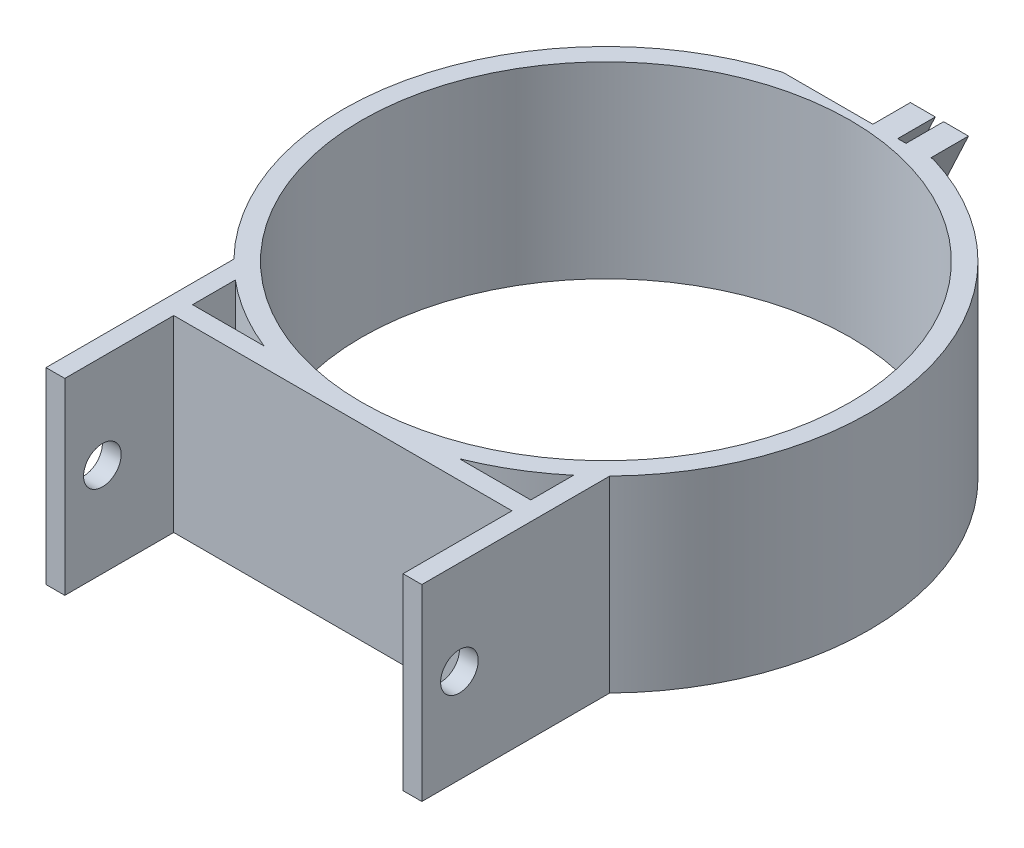
ISO-10303-21;
HEADER;
FILE_DESCRIPTION(('STEP AP214'),'2;1');
FILE_NAME('part.step','',(''),(''),'','','');
FILE_SCHEMA(('AUTOMOTIVE_DESIGN { 1 0 10303 214 1 1 1 1 }'));
ENDSEC;
DATA;
#1=APPLICATION_CONTEXT('core data for automotive mechanical design processes');
#2=APPLICATION_PROTOCOL_DEFINITION('international standard','automotive_design',2000,#1);
#3=PRODUCT_CONTEXT('',#1,'mechanical');
#4=PRODUCT('Part','Part','',(#3));
#5=PRODUCT_RELATED_PRODUCT_CATEGORY('part','',(#4));
#6=PRODUCT_DEFINITION_FORMATION('','',#4);
#7=PRODUCT_DEFINITION_CONTEXT('part definition',#1,'design');
#8=PRODUCT_DEFINITION('design','',#6,#7);
#9=PRODUCT_DEFINITION_SHAPE('','',#8);
#10=(LENGTH_UNIT() NAMED_UNIT(*) SI_UNIT(.MILLI.,.METRE.));
#11=(NAMED_UNIT(*) PLANE_ANGLE_UNIT() SI_UNIT($,.RADIAN.));
#12=(NAMED_UNIT(*) SI_UNIT($,.STERADIAN.) SOLID_ANGLE_UNIT());
#13=UNCERTAINTY_MEASURE_WITH_UNIT(LENGTH_MEASURE(1.E-05),#10,'distance_accuracy_value','');
#14=(GEOMETRIC_REPRESENTATION_CONTEXT(3) GLOBAL_UNCERTAINTY_ASSIGNED_CONTEXT((#13)) GLOBAL_UNIT_ASSIGNED_CONTEXT((#10,
#11,#12)) REPRESENTATION_CONTEXT('',''));
#15=CARTESIAN_POINT('',(0.,0.,0.));
#16=DIRECTION('',(0.,0.,1.));
#17=DIRECTION('',(1.,0.,0.));
#18=AXIS2_PLACEMENT_3D('',#15,#16,#17);
#19=CARTESIAN_POINT('',(-10.,25.,-38.5410196624969));
#20=DIRECTION('',(0.,0.,1.));
#21=DIRECTION('',(1.,0.,0.));
#22=AXIS2_PLACEMENT_3D('',#19,#20,#21);
#23=PLANE('',#22);
#24=DIRECTION('',(-1.,0.,0.));
#25=VECTOR('',#24,1.);
#26=CARTESIAN_POINT('',(-10.,0.,-38.5410196624969));
#27=LINE('',#26,#25);
#28=CARTESIAN_POINT('',(-6.38053468641869,0.,-38.5410196624969));
#29=VERTEX_POINT('',#28);
#30=CARTESIAN_POINT('',(-9.69066844330616,0.,-38.5410196624969));
#31=VERTEX_POINT('',#30);
#32=EDGE_CURVE('E355',#29,#31,#27,.T.);
#33=ORIENTED_EDGE('',*,*,#32,.T.);
#34=DIRECTION('',(-0.422618261740697,-0.906307787036651,0.));
#35=VECTOR('',#34,1.);
#36=CARTESIAN_POINT('',(-9.69066844330616,0.,-38.5410196624969));
#37=LINE('',#36,#35);
#38=CARTESIAN_POINT('',(1.96702301056874,25.,-38.5410196624969));
#39=VERTEX_POINT('',#38);
#40=EDGE_CURVE('E219',#39,#31,#37,.T.);
#41=ORIENTED_EDGE('',*,*,#40,.F.);
#42=DIRECTION('',(-1.,0.,0.));
#43=VECTOR('',#42,1.);
#44=CARTESIAN_POINT('',(-10.,25.,-38.5410196624969));
#45=LINE('',#44,#43);
#46=CARTESIAN_POINT('',(5.2771567674562,25.,-38.5410196624969));
#47=VERTEX_POINT('',#46);
#48=EDGE_CURVE('E334',#47,#39,#45,.T.);
#49=ORIENTED_EDGE('',*,*,#48,.F.);
#50=DIRECTION('',(0.422618261740697,0.906307787036651,0.));
#51=VECTOR('',#50,1.);
#52=CARTESIAN_POINT('',(5.2771567674562,25.,-38.5410196624969));
#53=LINE('',#52,#51);
#54=EDGE_CURVE('E241',#29,#47,#53,.T.);
#55=ORIENTED_EDGE('',*,*,#54,.F.);
#56=EDGE_LOOP('',(#33,#41,#49,#55));
#57=FACE_BOUND('',#56,.T.);
#58=ADVANCED_FACE('F33',(#57),#23,.F.);
#59=CARTESIAN_POINT('',(0.,25.,0.));
#60=DIRECTION('',(0.,1.,0.));
#61=DIRECTION('',(0.,0.,1.));
#62=AXIS2_PLACEMENT_3D('',#59,#60,#61);
#63=PLANE('',#62);
#64=DIRECTION('',(0.,0.,-1.));
#65=VECTOR('',#64,1.);
#66=CARTESIAN_POINT('',(9.69066844330617,25.,-33.5410196624969));
#67=LINE('',#66,#65);
#68=CARTESIAN_POINT('',(9.69066844330617,25.,-33.5410196624969));
#69=VERTEX_POINT('',#68);
#70=CARTESIAN_POINT('',(9.69066844330617,25.,-38.5410196624969));
#71=VERTEX_POINT('',#70);
#72=EDGE_CURVE('E195',#69,#71,#67,.T.);
#73=ORIENTED_EDGE('',*,*,#72,.T.);
#74=CARTESIAN_POINT('',(6.38053468641869,25.,-38.5410196624969));
#75=VERTEX_POINT('',#74);
#76=EDGE_CURVE('E57',#71,#75,#45,.T.);
#77=ORIENTED_EDGE('',*,*,#76,.T.);
#78=DIRECTION('',(0.,0.,-1.));
#79=VECTOR('',#78,1.);
#80=CARTESIAN_POINT('',(6.38053468641869,25.,-33.5410196624969));
#81=LINE('',#80,#79);
#82=CARTESIAN_POINT('',(6.38053468641869,25.,-33.5410196624969));
#83=VERTEX_POINT('',#82);
#84=EDGE_CURVE('E249',#83,#75,#81,.T.);
#85=ORIENTED_EDGE('',*,*,#84,.F.);
#86=DIRECTION('',(1.,0.,0.));
#87=VECTOR('',#86,1.);
#88=CARTESIAN_POINT('',(6.38053468641869,25.,-33.5410196624969));
#89=LINE('',#88,#87);
#90=CARTESIAN_POINT('',(5.2771567674562,25.,-33.5410196624969));
#91=VERTEX_POINT('',#90);
#92=EDGE_CURVE('E237',#91,#83,#89,.T.);
#93=ORIENTED_EDGE('',*,*,#92,.F.);
#94=DIRECTION('',(0.,0.,-1.));
#95=VECTOR('',#94,1.);
#96=CARTESIAN_POINT('',(5.2771567674562,25.,-33.5410196624969));
#97=LINE('',#96,#95);
#98=EDGE_CURVE('E253',#91,#47,#97,.T.);
#99=ORIENTED_EDGE('',*,*,#98,.T.);
#100=ORIENTED_EDGE('',*,*,#48,.T.);
#101=DIRECTION('',(0.,0.,-1.));
#102=VECTOR('',#101,1.);
#103=CARTESIAN_POINT('',(1.96702301056874,25.,-33.5410196624969));
#104=LINE('',#103,#102);
#105=CARTESIAN_POINT('',(1.96702301056874,25.,-33.5410196624969));
#106=VERTEX_POINT('',#105);
#107=EDGE_CURVE('E231',#106,#39,#104,.T.);
#108=ORIENTED_EDGE('',*,*,#107,.F.);
#109=DIRECTION('',(1.,0.,0.));
#110=VECTOR('',#109,1.);
#111=CARTESIAN_POINT('',(1.96702301056874,25.,-33.5410196624969));
#112=LINE('',#111,#110);
#113=CARTESIAN_POINT('',(-10.,25.,-33.5410196624969));
#114=VERTEX_POINT('',#113);
#115=EDGE_CURVE('E226',#114,#106,#112,.T.);
#116=ORIENTED_EDGE('',*,*,#115,.F.);
#117=CARTESIAN_POINT('',(0.,25.,0.));
#118=DIRECTION('',(0.,1.,0.));
#119=DIRECTION('',(0.,0.,1.));
#120=AXIS2_PLACEMENT_3D('',#117,#118,#119);
#121=CIRCLE('',#120,35.);
#122=CARTESIAN_POINT('',(-25.,25.,24.4948974278318));
#123=VERTEX_POINT('',#122);
#124=EDGE_CURVE('E336',#114,#123,#121,.T.);
#125=ORIENTED_EDGE('',*,*,#124,.T.);
#126=DIRECTION('',(0.,0.,1.));
#127=VECTOR('',#126,1.);
#128=CARTESIAN_POINT('',(-25.,25.,49.4948974278318));
#129=LINE('',#128,#127);
#130=CARTESIAN_POINT('',(-25.,25.,49.4948974278318));
#131=VERTEX_POINT('',#130);
#132=EDGE_CURVE('E317',#123,#131,#129,.T.);
#133=ORIENTED_EDGE('',*,*,#132,.T.);
#134=DIRECTION('',(1.,0.,0.));
#135=VECTOR('',#134,1.);
#136=CARTESIAN_POINT('',(-22.5,25.,49.4948974278318));
#137=LINE('',#136,#135);
#138=CARTESIAN_POINT('',(-22.5,25.,49.4948974278318));
#139=VERTEX_POINT('',#138);
#140=EDGE_CURVE('E320',#131,#139,#137,.T.);
#141=ORIENTED_EDGE('',*,*,#140,.T.);
#142=DIRECTION('',(0.,0.,-1.));
#143=VECTOR('',#142,1.);
#144=CARTESIAN_POINT('',(-22.5,25.,35.));
#145=LINE('',#144,#143);
#146=CARTESIAN_POINT('',(-22.5,25.,35.));
#147=VERTEX_POINT('',#146);
#148=EDGE_CURVE('E323',#139,#147,#145,.T.);
#149=ORIENTED_EDGE('',*,*,#148,.T.);
#150=DIRECTION('',(1.,0.,0.));
#151=VECTOR('',#150,1.);
#152=CARTESIAN_POINT('',(-22.5,25.,35.));
#153=LINE('',#152,#151);
#154=CARTESIAN_POINT('',(22.5,25.,35.));
#155=VERTEX_POINT('',#154);
#156=EDGE_CURVE('E325',#147,#155,#153,.T.);
#157=ORIENTED_EDGE('',*,*,#156,.T.);
#158=DIRECTION('',(0.,0.,1.));
#159=VECTOR('',#158,1.);
#160=CARTESIAN_POINT('',(22.5,25.,35.));
#161=LINE('',#160,#159);
#162=CARTESIAN_POINT('',(22.5,25.,49.4948974278318));
#163=VERTEX_POINT('',#162);
#164=EDGE_CURVE('E327',#155,#163,#161,.T.);
#165=ORIENTED_EDGE('',*,*,#164,.T.);
#166=DIRECTION('',(1.,0.,0.));
#167=VECTOR('',#166,1.);
#168=CARTESIAN_POINT('',(22.5,25.,49.4948974278318));
#169=LINE('',#168,#167);
#170=CARTESIAN_POINT('',(25.,25.,49.4948974278318));
#171=VERTEX_POINT('',#170);
#172=EDGE_CURVE('E329',#163,#171,#169,.T.);
#173=ORIENTED_EDGE('',*,*,#172,.T.);
#174=DIRECTION('',(0.,0.,-1.));
#175=VECTOR('',#174,1.);
#176=CARTESIAN_POINT('',(25.,25.,49.4948974278318));
#177=LINE('',#176,#175);
#178=CARTESIAN_POINT('',(25.,25.,24.4948974278318));
#179=VERTEX_POINT('',#178);
#180=EDGE_CURVE('E331',#171,#179,#177,.T.);
#181=ORIENTED_EDGE('',*,*,#180,.T.);
#182=CARTESIAN_POINT('',(0.,25.,0.));
#183=DIRECTION('',(0.,1.,0.));
#184=DIRECTION('',(0.,0.,1.));
#185=AXIS2_PLACEMENT_3D('',#182,#183,#184);
#186=CIRCLE('',#185,35.);
#187=CARTESIAN_POINT('',(9.99999999999999,25.,-33.5410196624969));
#188=VERTEX_POINT('',#187);
#189=EDGE_CURVE('E212',#179,#188,#186,.T.);
#190=ORIENTED_EDGE('',*,*,#189,.T.);
#191=DIRECTION('',(1.,0.,0.));
#192=VECTOR('',#191,1.);
#193=CARTESIAN_POINT('',(9.69066844330617,25.,-33.5410196624969));
#194=LINE('',#193,#192);
#195=EDGE_CURVE('E201',#69,#188,#194,.T.);
#196=ORIENTED_EDGE('',*,*,#195,.F.);
#197=EDGE_LOOP('',(#73,#77,#85,#93,#99,#100,#108,#116,#125,#133,#141,#149,#157,#165,#173,#181,
#190,#196));
#198=FACE_BOUND('',#197,.T.);
#199=CARTESIAN_POINT('',(0.,25.,0.));
#200=DIRECTION('',(0.,1.,0.));
#201=DIRECTION('',(0.,0.,1.));
#202=AXIS2_PLACEMENT_3D('',#199,#200,#201);
#203=CIRCLE('',#202,32.5);
#204=CARTESIAN_POINT('',(0.,25.,32.5));
#205=VERTEX_POINT('',#204);
#206=EDGE_CURVE('E311',#205,#205,#203,.T.);
#207=ORIENTED_EDGE('',*,*,#206,.F.);
#208=EDGE_LOOP('',(#207));
#209=FACE_BOUND('',#208,.T.);
#210=DIRECTION('',(0.,0.,1.));
#211=VECTOR('',#210,1.);
#212=CARTESIAN_POINT('',(-22.5,25.,26.809513236909));
#213=LINE('',#212,#211);
#214=CARTESIAN_POINT('',(-22.5,25.,26.809513236909));
#215=VERTEX_POINT('',#214);
#216=CARTESIAN_POINT('',(-22.5,25.,32.5));
#217=VERTEX_POINT('',#216);
#218=EDGE_CURVE('E289',#215,#217,#213,.T.);
#219=ORIENTED_EDGE('',*,*,#218,.F.);
#220=CARTESIAN_POINT('',(0.,25.,0.));
#221=DIRECTION('',(0.,-1.,0.));
#222=DIRECTION('',(0.,0.,1.));
#223=AXIS2_PLACEMENT_3D('',#220,#221,#222);
#224=CIRCLE('',#223,35.);
#225=CARTESIAN_POINT('',(-12.9903810567666,25.,32.5));
#226=VERTEX_POINT('',#225);
#227=EDGE_CURVE('E287',#226,#215,#224,.T.);
#228=ORIENTED_EDGE('',*,*,#227,.F.);
#229=DIRECTION('',(1.,0.,0.));
#230=VECTOR('',#229,1.);
#231=CARTESIAN_POINT('',(-22.5,25.,32.5));
#232=LINE('',#231,#230);
#233=EDGE_CURVE('E293',#217,#226,#232,.T.);
#234=ORIENTED_EDGE('',*,*,#233,.F.);
#235=EDGE_LOOP('',(#219,#228,#234));
#236=FACE_BOUND('',#235,.T.);
#237=DIRECTION('',(1.,0.,0.));
#238=VECTOR('',#237,1.);
#239=CARTESIAN_POINT('',(12.9903810567666,25.,32.5));
#240=LINE('',#239,#238);
#241=CARTESIAN_POINT('',(12.9903810567666,25.,32.5));
#242=VERTEX_POINT('',#241);
#243=CARTESIAN_POINT('',(22.5,25.,32.5));
#244=VERTEX_POINT('',#243);
#245=EDGE_CURVE('E265',#242,#244,#240,.T.);
#246=ORIENTED_EDGE('',*,*,#245,.F.);
#247=CARTESIAN_POINT('',(0.,25.,0.));
#248=DIRECTION('',(0.,-1.,0.));
#249=DIRECTION('',(0.,0.,1.));
#250=AXIS2_PLACEMENT_3D('',#247,#248,#249);
#251=CIRCLE('',#250,35.);
#252=CARTESIAN_POINT('',(22.5,25.,26.809513236909));
#253=VERTEX_POINT('',#252);
#254=EDGE_CURVE('E263',#253,#242,#251,.T.);
#255=ORIENTED_EDGE('',*,*,#254,.F.);
#256=DIRECTION('',(0.,0.,-1.));
#257=VECTOR('',#256,1.);
#258=CARTESIAN_POINT('',(22.5,25.,32.5));
#259=LINE('',#258,#257);
#260=EDGE_CURVE('E269',#244,#253,#259,.T.);
#261=ORIENTED_EDGE('',*,*,#260,.F.);
#262=EDGE_LOOP('',(#246,#255,#261));
#263=FACE_BOUND('',#262,.T.);
#264=ADVANCED_FACE('F209',(#198,#209,#236,#263),#63,.T.);
#265=CARTESIAN_POINT('',(0.,0.,0.));
#266=DIRECTION('',(0.,1.,0.));
#267=DIRECTION('',(0.,0.,1.));
#268=AXIS2_PLACEMENT_3D('',#265,#266,#267);
#269=PLANE('',#268);
#270=CARTESIAN_POINT('',(-1.96702301056873,0.,-38.5410196624969));
#271=VERTEX_POINT('',#270);
#272=CARTESIAN_POINT('',(-5.2771567674562,0.,-38.5410196624969));
#273=VERTEX_POINT('',#272);
#274=EDGE_CURVE('E356',#271,#273,#27,.T.);
#275=ORIENTED_EDGE('',*,*,#274,.F.);
#276=DIRECTION('',(0.,0.,-1.));
#277=VECTOR('',#276,1.);
#278=CARTESIAN_POINT('',(-1.96702301056873,0.,-33.5410196624969));
#279=LINE('',#278,#277);
#280=CARTESIAN_POINT('',(-1.96702301056873,0.,-33.5410196624969));
#281=VERTEX_POINT('',#280);
#282=EDGE_CURVE('E49',#281,#271,#279,.T.);
#283=ORIENTED_EDGE('',*,*,#282,.F.);
#284=DIRECTION('',(1.,0.,0.));
#285=VECTOR('',#284,1.);
#286=CARTESIAN_POINT('',(0.,0.,-33.5410196624969));
#287=LINE('',#286,#285);
#288=CARTESIAN_POINT('',(9.99999999999999,0.,-33.5410196624969));
#289=VERTEX_POINT('',#288);
#290=EDGE_CURVE('E207',#281,#289,#287,.T.);
#291=ORIENTED_EDGE('',*,*,#290,.T.);
#292=CARTESIAN_POINT('',(0.,0.,0.));
#293=DIRECTION('',(0.,1.,0.));
#294=DIRECTION('',(0.,0.,1.));
#295=AXIS2_PLACEMENT_3D('',#292,#293,#294);
#296=CIRCLE('',#295,35.);
#297=CARTESIAN_POINT('',(25.,0.,24.4948974278318));
#298=VERTEX_POINT('',#297);
#299=EDGE_CURVE('E352',#298,#289,#296,.T.);
#300=ORIENTED_EDGE('',*,*,#299,.F.);
#301=DIRECTION('',(0.,0.,-1.));
#302=VECTOR('',#301,1.);
#303=CARTESIAN_POINT('',(25.,0.,35.));
#304=LINE('',#303,#302);
#305=CARTESIAN_POINT('',(25.,0.,49.4948974278318));
#306=VERTEX_POINT('',#305);
#307=EDGE_CURVE('E350',#306,#298,#304,.T.);
#308=ORIENTED_EDGE('',*,*,#307,.F.);
#309=DIRECTION('',(1.,0.,0.));
#310=VECTOR('',#309,1.);
#311=CARTESIAN_POINT('',(22.5,0.,49.4948974278318));
#312=LINE('',#311,#310);
#313=CARTESIAN_POINT('',(22.5,0.,49.4948974278318));
#314=VERTEX_POINT('',#313);
#315=EDGE_CURVE('E347',#314,#306,#312,.T.);
#316=ORIENTED_EDGE('',*,*,#315,.F.);
#317=DIRECTION('',(0.,0.,1.));
#318=VECTOR('',#317,1.);
#319=CARTESIAN_POINT('',(22.5,0.,35.));
#320=LINE('',#319,#318);
#321=CARTESIAN_POINT('',(22.5,0.,35.));
#322=VERTEX_POINT('',#321);
#323=EDGE_CURVE('E345',#322,#314,#320,.T.);
#324=ORIENTED_EDGE('',*,*,#323,.F.);
#325=DIRECTION('',(1.,0.,0.));
#326=VECTOR('',#325,1.);
#327=CARTESIAN_POINT('',(-22.5,0.,35.));
#328=LINE('',#327,#326);
#329=CARTESIAN_POINT('',(-22.5,0.,35.));
#330=VERTEX_POINT('',#329);
#331=EDGE_CURVE('E343',#330,#322,#328,.T.);
#332=ORIENTED_EDGE('',*,*,#331,.F.);
#333=DIRECTION('',(0.,0.,-1.));
#334=VECTOR('',#333,1.);
#335=CARTESIAN_POINT('',(-22.5,0.,35.));
#336=LINE('',#335,#334);
#337=CARTESIAN_POINT('',(-22.5,0.,49.4948974278318));
#338=VERTEX_POINT('',#337);
#339=EDGE_CURVE('E341',#338,#330,#336,.T.);
#340=ORIENTED_EDGE('',*,*,#339,.F.);
#341=DIRECTION('',(1.,0.,0.));
#342=VECTOR('',#341,1.);
#343=CARTESIAN_POINT('',(-22.5,0.,49.4948974278318));
#344=LINE('',#343,#342);
#345=CARTESIAN_POINT('',(-25.,0.,49.4948974278318));
#346=VERTEX_POINT('',#345);
#347=EDGE_CURVE('E314',#346,#338,#344,.T.);
#348=ORIENTED_EDGE('',*,*,#347,.F.);
#349=DIRECTION('',(0.,0.,1.));
#350=VECTOR('',#349,1.);
#351=CARTESIAN_POINT('',(-25.,0.,35.));
#352=LINE('',#351,#350);
#353=CARTESIAN_POINT('',(-25.,0.,24.4948974278318));
#354=VERTEX_POINT('',#353);
#355=EDGE_CURVE('E321',#354,#346,#352,.T.);
#356=ORIENTED_EDGE('',*,*,#355,.F.);
#357=CARTESIAN_POINT('',(0.,0.,0.));
#358=DIRECTION('',(0.,1.,0.));
#359=DIRECTION('',(0.,0.,1.));
#360=AXIS2_PLACEMENT_3D('',#357,#358,#359);
#361=CIRCLE('',#360,35.);
#362=CARTESIAN_POINT('',(-9.99999999999998,0.,-33.5410196624969));
#363=VERTEX_POINT('',#362);
#364=EDGE_CURVE('E358',#363,#354,#361,.T.);
#365=ORIENTED_EDGE('',*,*,#364,.F.);
#366=DIRECTION('',(-1.,0.,0.));
#367=VECTOR('',#366,1.);
#368=CARTESIAN_POINT('',(-9.99999999999999,0.,-33.5410196624969));
#369=LINE('',#368,#367);
#370=CARTESIAN_POINT('',(-9.69066844330616,0.,-33.5410196624969));
#371=VERTEX_POINT('',#370);
#372=EDGE_CURVE('E224',#371,#363,#369,.T.);
#373=ORIENTED_EDGE('',*,*,#372,.F.);
#374=DIRECTION('',(0.,0.,-1.));
#375=VECTOR('',#374,1.);
#376=CARTESIAN_POINT('',(-9.69066844330616,0.,-33.5410196624969));
#377=LINE('',#376,#375);
#378=EDGE_CURVE('E229',#371,#31,#377,.T.);
#379=ORIENTED_EDGE('',*,*,#378,.T.);
#380=ORIENTED_EDGE('',*,*,#32,.F.);
#381=DIRECTION('',(0.,0.,-1.));
#382=VECTOR('',#381,1.);
#383=CARTESIAN_POINT('',(-6.38053468641869,0.,-33.5410196624969));
#384=LINE('',#383,#382);
#385=CARTESIAN_POINT('',(-6.38053468641869,0.,-33.5410196624969));
#386=VERTEX_POINT('',#385);
#387=EDGE_CURVE('E257',#386,#29,#384,.T.);
#388=ORIENTED_EDGE('',*,*,#387,.F.);
#389=DIRECTION('',(-1.,0.,0.));
#390=VECTOR('',#389,1.);
#391=CARTESIAN_POINT('',(-6.38053468641869,0.,-33.5410196624969));
#392=LINE('',#391,#390);
#393=CARTESIAN_POINT('',(-5.2771567674562,0.,-33.5410196624969));
#394=VERTEX_POINT('',#393);
#395=EDGE_CURVE('E244',#394,#386,#392,.T.);
#396=ORIENTED_EDGE('',*,*,#395,.F.);
#397=DIRECTION('',(0.,0.,-1.));
#398=VECTOR('',#397,1.);
#399=CARTESIAN_POINT('',(-5.2771567674562,0.,-33.5410196624969));
#400=LINE('',#399,#398);
#401=EDGE_CURVE('E259',#394,#273,#400,.T.);
#402=ORIENTED_EDGE('',*,*,#401,.T.);
#403=EDGE_LOOP('',(#275,#283,#291,#300,#308,#316,#324,#332,#340,#348,#356,#365,#373,#379,#380,
#388,#396,#402));
#404=FACE_BOUND('',#403,.T.);
#405=CARTESIAN_POINT('',(0.,0.,0.));
#406=DIRECTION('',(0.,-1.,0.));
#407=DIRECTION('',(0.,0.,1.));
#408=AXIS2_PLACEMENT_3D('',#405,#406,#407);
#409=CIRCLE('',#408,35.);
#410=CARTESIAN_POINT('',(-12.9903810567666,0.,32.5));
#411=VERTEX_POINT('',#410);
#412=CARTESIAN_POINT('',(-22.5,0.,26.809513236909));
#413=VERTEX_POINT('',#412);
#414=EDGE_CURVE('E286',#411,#413,#409,.T.);
#415=ORIENTED_EDGE('',*,*,#414,.T.);
#416=DIRECTION('',(0.,0.,1.));
#417=VECTOR('',#416,1.);
#418=CARTESIAN_POINT('',(-22.5,0.,26.809513236909));
#419=LINE('',#418,#417);
#420=CARTESIAN_POINT('',(-22.5,0.,32.5));
#421=VERTEX_POINT('',#420);
#422=EDGE_CURVE('E298',#413,#421,#419,.T.);
#423=ORIENTED_EDGE('',*,*,#422,.T.);
#424=DIRECTION('',(1.,0.,0.));
#425=VECTOR('',#424,1.);
#426=CARTESIAN_POINT('',(-22.5,0.,32.5));
#427=LINE('',#426,#425);
#428=EDGE_CURVE('E290',#421,#411,#427,.T.);
#429=ORIENTED_EDGE('',*,*,#428,.T.);
#430=EDGE_LOOP('',(#415,#423,#429));
#431=FACE_BOUND('',#430,.T.);
#432=CARTESIAN_POINT('',(0.,0.,0.));
#433=DIRECTION('',(0.,1.,0.));
#434=DIRECTION('',(0.,0.,1.));
#435=AXIS2_PLACEMENT_3D('',#432,#433,#434);
#436=CIRCLE('',#435,32.5);
#437=CARTESIAN_POINT('',(0.,0.,32.5));
#438=VERTEX_POINT('',#437);
#439=EDGE_CURVE('E310',#438,#438,#436,.T.);
#440=ORIENTED_EDGE('',*,*,#439,.T.);
#441=EDGE_LOOP('',(#440));
#442=FACE_BOUND('',#441,.T.);
#443=CARTESIAN_POINT('',(0.,0.,0.));
#444=DIRECTION('',(0.,-1.,0.));
#445=DIRECTION('',(0.,0.,1.));
#446=AXIS2_PLACEMENT_3D('',#443,#444,#445);
#447=CIRCLE('',#446,35.);
#448=CARTESIAN_POINT('',(22.5,0.,26.809513236909));
#449=VERTEX_POINT('',#448);
#450=CARTESIAN_POINT('',(12.9903810567666,0.,32.5));
#451=VERTEX_POINT('',#450);
#452=EDGE_CURVE('E256',#449,#451,#447,.T.);
#453=ORIENTED_EDGE('',*,*,#452,.T.);
#454=DIRECTION('',(1.,0.,0.));
#455=VECTOR('',#454,1.);
#456=CARTESIAN_POINT('',(12.9903810567666,0.,32.5));
#457=LINE('',#456,#455);
#458=CARTESIAN_POINT('',(22.5,0.,32.5));
#459=VERTEX_POINT('',#458);
#460=EDGE_CURVE('E274',#451,#459,#457,.T.);
#461=ORIENTED_EDGE('',*,*,#460,.T.);
#462=DIRECTION('',(0.,0.,-1.));
#463=VECTOR('',#462,1.);
#464=CARTESIAN_POINT('',(22.5,0.,32.5));
#465=LINE('',#464,#463);
#466=EDGE_CURVE('E266',#459,#449,#465,.T.);
#467=ORIENTED_EDGE('',*,*,#466,.T.);
#468=EDGE_LOOP('',(#453,#461,#467));
#469=FACE_BOUND('',#468,.T.);
#470=ADVANCED_FACE('F395',(#404,#431,#442,#469),#269,.F.);
#471=CARTESIAN_POINT('',(-22.5,25.,49.4948974278318));
#472=DIRECTION('',(0.,0.,-1.));
#473=DIRECTION('',(-1.,0.,0.));
#474=AXIS2_PLACEMENT_3D('',#471,#472,#473);
#475=PLANE('',#474);
#476=ORIENTED_EDGE('',*,*,#347,.T.);
#477=DIRECTION('',(0.,-1.,0.));
#478=VECTOR('',#477,1.);
#479=CARTESIAN_POINT('',(-22.5,25.,49.4948974278318));
#480=LINE('',#479,#478);
#481=EDGE_CURVE('E42',#139,#338,#480,.T.);
#482=ORIENTED_EDGE('',*,*,#481,.F.);
#483=ORIENTED_EDGE('',*,*,#140,.F.);
#484=DIRECTION('',(0.,-1.,0.));
#485=VECTOR('',#484,1.);
#486=CARTESIAN_POINT('',(-25.,25.,49.4948974278318));
#487=LINE('',#486,#485);
#488=EDGE_CURVE('E11',#131,#346,#487,.T.);
#489=ORIENTED_EDGE('',*,*,#488,.T.);
#490=EDGE_LOOP('',(#476,#482,#483,#489));
#491=FACE_BOUND('',#490,.T.);
#492=ADVANCED_FACE('F35',(#491),#475,.F.);
#493=CARTESIAN_POINT('',(-22.5,25.,35.));
#494=DIRECTION('',(-1.,0.,0.));
#495=DIRECTION('',(0.,0.,1.));
#496=AXIS2_PLACEMENT_3D('',#493,#494,#495);
#497=PLANE('',#496);
#498=CARTESIAN_POINT('',(-22.5,12.5,44.4948974278318));
#499=DIRECTION('',(-1.,0.,0.));
#500=DIRECTION('',(0.,0.,1.));
#501=AXIS2_PLACEMENT_3D('',#498,#499,#500);
#502=CIRCLE('',#501,2.5);
#503=CARTESIAN_POINT('',(-22.5,12.5,46.9948974278318));
#504=VERTEX_POINT('',#503);
#505=EDGE_CURVE('E218',#504,#504,#502,.T.);
#506=ORIENTED_EDGE('',*,*,#505,.T.);
#507=EDGE_LOOP('',(#506));
#508=FACE_BOUND('',#507,.T.);
#509=ORIENTED_EDGE('',*,*,#339,.T.);
#510=DIRECTION('',(0.,-1.,0.));
#511=VECTOR('',#510,1.);
#512=CARTESIAN_POINT('',(-22.5,25.,35.));
#513=LINE('',#512,#511);
#514=EDGE_CURVE('E380',#147,#330,#513,.T.);
#515=ORIENTED_EDGE('',*,*,#514,.F.);
#516=ORIENTED_EDGE('',*,*,#148,.F.);
#517=ORIENTED_EDGE('',*,*,#481,.T.);
#518=EDGE_LOOP('',(#509,#515,#516,#517));
#519=FACE_BOUND('',#518,.T.);
#520=ADVANCED_FACE('F388',(#508,#519),#497,.F.);
#521=CARTESIAN_POINT('',(-22.5,25.,35.));
#522=DIRECTION('',(0.,0.,-1.));
#523=DIRECTION('',(-1.,0.,0.));
#524=AXIS2_PLACEMENT_3D('',#521,#522,#523);
#525=PLANE('',#524);
#526=ORIENTED_EDGE('',*,*,#331,.T.);
#527=DIRECTION('',(0.,-1.,0.));
#528=VECTOR('',#527,1.);
#529=CARTESIAN_POINT('',(22.5,25.,35.));
#530=LINE('',#529,#528);
#531=EDGE_CURVE('E377',#155,#322,#530,.T.);
#532=ORIENTED_EDGE('',*,*,#531,.F.);
#533=ORIENTED_EDGE('',*,*,#156,.F.);
#534=ORIENTED_EDGE('',*,*,#514,.T.);
#535=EDGE_LOOP('',(#526,#532,#533,#534));
#536=FACE_BOUND('',#535,.T.);
#537=ADVANCED_FACE('F402',(#536),#525,.F.);
#538=CARTESIAN_POINT('',(22.5,25.,35.));
#539=DIRECTION('',(1.,0.,0.));
#540=DIRECTION('',(0.,0.,-1.));
#541=AXIS2_PLACEMENT_3D('',#538,#539,#540);
#542=PLANE('',#541);
#543=CARTESIAN_POINT('',(22.5,12.5,44.4948974278318));
#544=DIRECTION('',(1.,0.,0.));
#545=DIRECTION('',(0.,0.,-1.));
#546=AXIS2_PLACEMENT_3D('',#543,#544,#545);
#547=CIRCLE('',#546,2.5);
#548=CARTESIAN_POINT('',(22.5,12.5,41.9948974278318));
#549=VERTEX_POINT('',#548);
#550=EDGE_CURVE('E582',#549,#549,#547,.T.);
#551=ORIENTED_EDGE('',*,*,#550,.T.);
#552=EDGE_LOOP('',(#551));
#553=FACE_BOUND('',#552,.T.);
#554=ORIENTED_EDGE('',*,*,#323,.T.);
#555=DIRECTION('',(0.,-1.,0.));
#556=VECTOR('',#555,1.);
#557=CARTESIAN_POINT('',(22.5,25.,49.4948974278318));
#558=LINE('',#557,#556);
#559=EDGE_CURVE('E374',#163,#314,#558,.T.);
#560=ORIENTED_EDGE('',*,*,#559,.F.);
#561=ORIENTED_EDGE('',*,*,#164,.F.);
#562=ORIENTED_EDGE('',*,*,#531,.T.);
#563=EDGE_LOOP('',(#554,#560,#561,#562));
#564=FACE_BOUND('',#563,.T.);
#565=ADVANCED_FACE('F406',(#553,#564),#542,.F.);
#566=CARTESIAN_POINT('',(22.5,25.,49.4948974278318));
#567=DIRECTION('',(0.,0.,-1.));
#568=DIRECTION('',(-1.,0.,0.));
#569=AXIS2_PLACEMENT_3D('',#566,#567,#568);
#570=PLANE('',#569);
#571=ORIENTED_EDGE('',*,*,#315,.T.);
#572=DIRECTION('',(0.,-1.,0.));
#573=VECTOR('',#572,1.);
#574=CARTESIAN_POINT('',(25.,25.,49.4948974278318));
#575=LINE('',#574,#573);
#576=EDGE_CURVE('E371',#171,#306,#575,.T.);
#577=ORIENTED_EDGE('',*,*,#576,.F.);
#578=ORIENTED_EDGE('',*,*,#172,.F.);
#579=ORIENTED_EDGE('',*,*,#559,.T.);
#580=EDGE_LOOP('',(#571,#577,#578,#579));
#581=FACE_BOUND('',#580,.T.);
#582=ADVANCED_FACE('F453',(#581),#570,.F.);
#583=CARTESIAN_POINT('',(25.,25.,35.));
#584=DIRECTION('',(-1.,0.,0.));
#585=DIRECTION('',(0.,0.,1.));
#586=AXIS2_PLACEMENT_3D('',#583,#584,#585);
#587=PLANE('',#586);
#588=CARTESIAN_POINT('',(25.,12.5,44.4948974278318));
#589=DIRECTION('',(-1.,0.,0.));
#590=DIRECTION('',(0.,0.,1.));
#591=AXIS2_PLACEMENT_3D('',#588,#589,#590);
#592=CIRCLE('',#591,2.5);
#593=CARTESIAN_POINT('',(25.,12.5,46.9948974278318));
#594=VERTEX_POINT('',#593);
#595=EDGE_CURVE('E584',#594,#594,#592,.T.);
#596=ORIENTED_EDGE('',*,*,#595,.T.);
#597=EDGE_LOOP('',(#596));
#598=FACE_BOUND('',#597,.T.);
#599=ORIENTED_EDGE('',*,*,#307,.T.);
#600=DIRECTION('',(0.,-1.,0.));
#601=VECTOR('',#600,1.);
#602=CARTESIAN_POINT('',(25.,25.,24.4948974278318));
#603=LINE('',#602,#601);
#604=EDGE_CURVE('E368',#179,#298,#603,.T.);
#605=ORIENTED_EDGE('',*,*,#604,.F.);
#606=ORIENTED_EDGE('',*,*,#180,.F.);
#607=ORIENTED_EDGE('',*,*,#576,.T.);
#608=EDGE_LOOP('',(#599,#605,#606,#607));
#609=FACE_BOUND('',#608,.T.);
#610=ADVANCED_FACE('F451',(#598,#609),#587,.F.);
#611=CARTESIAN_POINT('',(0.,25.,0.));
#612=DIRECTION('',(0.,-1.,0.));
#613=DIRECTION('',(0.,0.,-1.));
#614=AXIS2_PLACEMENT_3D('',#611,#612,#613);
#615=CYLINDRICAL_SURFACE('',#614,35.);
#616=ORIENTED_EDGE('',*,*,#299,.T.);
#617=DIRECTION('',(0.,-1.,0.));
#618=VECTOR('',#617,1.);
#619=CARTESIAN_POINT('',(10.,25.,-33.5410196624969));
#620=LINE('',#619,#618);
#621=EDGE_CURVE('E366',#188,#289,#620,.T.);
#622=ORIENTED_EDGE('',*,*,#621,.F.);
#623=ORIENTED_EDGE('',*,*,#189,.F.);
#624=ORIENTED_EDGE('',*,*,#604,.T.);
#625=EDGE_LOOP('',(#616,#622,#623,#624));
#626=FACE_BOUND('',#625,.T.);
#627=ADVANCED_FACE('F447',(#626),#615,.T.);
#628=ORIENTED_EDGE('',*,*,#76,.F.);
#629=DIRECTION('',(0.422618261740697,0.906307787036651,0.));
#630=VECTOR('',#629,1.);
#631=CARTESIAN_POINT('',(-1.96702301056873,0.,-38.5410196624969));
#632=LINE('',#631,#630);
#633=EDGE_CURVE('E199',#271,#71,#632,.T.);
#634=ORIENTED_EDGE('',*,*,#633,.F.);
#635=ORIENTED_EDGE('',*,*,#274,.T.);
#636=DIRECTION('',(-0.422618261740697,-0.906307787036651,0.));
#637=VECTOR('',#636,1.);
#638=CARTESIAN_POINT('',(6.38053468641869,25.,-38.5410196624969));
#639=LINE('',#638,#637);
#640=EDGE_CURVE('E236',#75,#273,#639,.T.);
#641=ORIENTED_EDGE('',*,*,#640,.F.);
#642=EDGE_LOOP('',(#628,#634,#635,#641));
#643=FACE_BOUND('',#642,.T.);
#644=ADVANCED_FACE('F444',(#643),#23,.F.);
#645=CARTESIAN_POINT('',(0.,25.,0.));
#646=DIRECTION('',(0.,-1.,0.));
#647=DIRECTION('',(0.,0.,-1.));
#648=AXIS2_PLACEMENT_3D('',#645,#646,#647);
#649=CYLINDRICAL_SURFACE('',#648,35.);
#650=ORIENTED_EDGE('',*,*,#364,.T.);
#651=DIRECTION('',(0.,-1.,0.));
#652=VECTOR('',#651,1.);
#653=CARTESIAN_POINT('',(-25.,25.,24.4948974278318));
#654=LINE('',#653,#652);
#655=EDGE_CURVE('E339',#123,#354,#654,.T.);
#656=ORIENTED_EDGE('',*,*,#655,.F.);
#657=ORIENTED_EDGE('',*,*,#124,.F.);
#658=DIRECTION('',(0.,-1.,0.));
#659=VECTOR('',#658,1.);
#660=CARTESIAN_POINT('',(-9.99999999999998,25.,-33.5410196624969));
#661=LINE('',#660,#659);
#662=EDGE_CURVE('E363',#114,#363,#661,.T.);
#663=ORIENTED_EDGE('',*,*,#662,.T.);
#664=EDGE_LOOP('',(#650,#656,#657,#663));
#665=FACE_BOUND('',#664,.T.);
#666=ADVANCED_FACE('F417',(#665),#649,.T.);
#667=CARTESIAN_POINT('',(-25.,25.,35.));
#668=DIRECTION('',(1.,0.,0.));
#669=DIRECTION('',(0.,0.,-1.));
#670=AXIS2_PLACEMENT_3D('',#667,#668,#669);
#671=PLANE('',#670);
#672=CARTESIAN_POINT('',(-25.,12.5,44.4948974278318));
#673=DIRECTION('',(1.,0.,0.));
#674=DIRECTION('',(0.,0.,-1.));
#675=AXIS2_PLACEMENT_3D('',#672,#673,#674);
#676=CIRCLE('',#675,2.5);
#677=CARTESIAN_POINT('',(-25.,12.5,41.9948974278318));
#678=VERTEX_POINT('',#677);
#679=EDGE_CURVE('E37',#678,#678,#676,.T.);
#680=ORIENTED_EDGE('',*,*,#679,.T.);
#681=EDGE_LOOP('',(#680));
#682=FACE_BOUND('',#681,.T.);
#683=ORIENTED_EDGE('',*,*,#355,.T.);
#684=ORIENTED_EDGE('',*,*,#488,.F.);
#685=ORIENTED_EDGE('',*,*,#132,.F.);
#686=ORIENTED_EDGE('',*,*,#655,.T.);
#687=EDGE_LOOP('',(#683,#684,#685,#686));
#688=FACE_BOUND('',#687,.T.);
#689=ADVANCED_FACE('F412',(#682,#688),#671,.F.);
#690=CARTESIAN_POINT('',(0.,25.,0.));
#691=DIRECTION('',(0.,-1.,0.));
#692=DIRECTION('',(0.,0.,-1.));
#693=AXIS2_PLACEMENT_3D('',#690,#691,#692);
#694=CYLINDRICAL_SURFACE('',#693,32.5);
#695=ORIENTED_EDGE('',*,*,#206,.T.);
#696=EDGE_LOOP('',(#695));
#697=FACE_BOUND('',#696,.T.);
#698=ORIENTED_EDGE('',*,*,#439,.F.);
#699=EDGE_LOOP('',(#698));
#700=FACE_BOUND('',#699,.T.);
#701=ADVANCED_FACE('F498',(#697,#700),#694,.F.);
#702=CARTESIAN_POINT('',(0.,25.,0.));
#703=DIRECTION('',(0.,-1.,0.));
#704=DIRECTION('',(0.,0.,-1.));
#705=AXIS2_PLACEMENT_3D('',#702,#703,#704);
#706=CYLINDRICAL_SURFACE('',#705,35.);
#707=ORIENTED_EDGE('',*,*,#414,.F.);
#708=DIRECTION('',(0.,-1.,0.));
#709=VECTOR('',#708,1.);
#710=CARTESIAN_POINT('',(-12.9903810567666,25.,32.5));
#711=LINE('',#710,#709);
#712=EDGE_CURVE('E295',#226,#411,#711,.T.);
#713=ORIENTED_EDGE('',*,*,#712,.F.);
#714=ORIENTED_EDGE('',*,*,#227,.T.);
#715=DIRECTION('',(0.,-1.,0.));
#716=VECTOR('',#715,1.);
#717=CARTESIAN_POINT('',(-22.5,25.,26.809513236909));
#718=LINE('',#717,#716);
#719=EDGE_CURVE('E307',#215,#413,#718,.T.);
#720=ORIENTED_EDGE('',*,*,#719,.T.);
#721=EDGE_LOOP('',(#707,#713,#714,#720));
#722=FACE_BOUND('',#721,.T.);
#723=ADVANCED_FACE('F562',(#722),#706,.T.);
#724=CARTESIAN_POINT('',(-22.5,25.,26.809513236909));
#725=DIRECTION('',(1.,0.,0.));
#726=DIRECTION('',(0.,0.,-1.));
#727=AXIS2_PLACEMENT_3D('',#724,#725,#726);
#728=PLANE('',#727);
#729=ORIENTED_EDGE('',*,*,#422,.F.);
#730=ORIENTED_EDGE('',*,*,#719,.F.);
#731=ORIENTED_EDGE('',*,*,#218,.T.);
#732=DIRECTION('',(0.,-1.,0.));
#733=VECTOR('',#732,1.);
#734=CARTESIAN_POINT('',(-22.5,25.,32.5));
#735=LINE('',#734,#733);
#736=EDGE_CURVE('E305',#217,#421,#735,.T.);
#737=ORIENTED_EDGE('',*,*,#736,.T.);
#738=EDGE_LOOP('',(#729,#730,#731,#737));
#739=FACE_BOUND('',#738,.T.);
#740=ADVANCED_FACE('F558',(#739),#728,.T.);
#741=CARTESIAN_POINT('',(-22.5,25.,32.5));
#742=DIRECTION('',(0.,0.,-1.));
#743=DIRECTION('',(-1.,0.,0.));
#744=AXIS2_PLACEMENT_3D('',#741,#742,#743);
#745=PLANE('',#744);
#746=ORIENTED_EDGE('',*,*,#428,.F.);
#747=ORIENTED_EDGE('',*,*,#736,.F.);
#748=ORIENTED_EDGE('',*,*,#233,.T.);
#749=ORIENTED_EDGE('',*,*,#712,.T.);
#750=EDGE_LOOP('',(#746,#747,#748,#749));
#751=FACE_BOUND('',#750,.T.);
#752=ADVANCED_FACE('F554',(#751),#745,.T.);
#753=CARTESIAN_POINT('',(0.,25.,0.));
#754=DIRECTION('',(0.,-1.,0.));
#755=DIRECTION('',(0.,0.,-1.));
#756=AXIS2_PLACEMENT_3D('',#753,#754,#755);
#757=CYLINDRICAL_SURFACE('',#756,35.);
#758=ORIENTED_EDGE('',*,*,#452,.F.);
#759=DIRECTION('',(0.,-1.,0.));
#760=VECTOR('',#759,1.);
#761=CARTESIAN_POINT('',(22.5,25.,26.809513236909));
#762=LINE('',#761,#760);
#763=EDGE_CURVE('E271',#253,#449,#762,.T.);
#764=ORIENTED_EDGE('',*,*,#763,.F.);
#765=ORIENTED_EDGE('',*,*,#254,.T.);
#766=DIRECTION('',(0.,-1.,0.));
#767=VECTOR('',#766,1.);
#768=CARTESIAN_POINT('',(12.9903810567666,25.,32.5));
#769=LINE('',#768,#767);
#770=EDGE_CURVE('E283',#242,#451,#769,.T.);
#771=ORIENTED_EDGE('',*,*,#770,.T.);
#772=EDGE_LOOP('',(#758,#764,#765,#771));
#773=FACE_BOUND('',#772,.T.);
#774=ADVANCED_FACE('F550',(#773),#757,.T.);
#775=CARTESIAN_POINT('',(12.9903810567666,25.,32.5));
#776=DIRECTION('',(0.,0.,-1.));
#777=DIRECTION('',(-1.,0.,0.));
#778=AXIS2_PLACEMENT_3D('',#775,#776,#777);
#779=PLANE('',#778);
#780=ORIENTED_EDGE('',*,*,#460,.F.);
#781=ORIENTED_EDGE('',*,*,#770,.F.);
#782=ORIENTED_EDGE('',*,*,#245,.T.);
#783=DIRECTION('',(0.,-1.,0.));
#784=VECTOR('',#783,1.);
#785=CARTESIAN_POINT('',(22.5,25.,32.5));
#786=LINE('',#785,#784);
#787=EDGE_CURVE('E281',#244,#459,#786,.T.);
#788=ORIENTED_EDGE('',*,*,#787,.T.);
#789=EDGE_LOOP('',(#780,#781,#782,#788));
#790=FACE_BOUND('',#789,.T.);
#791=ADVANCED_FACE('F546',(#790),#779,.T.);
#792=CARTESIAN_POINT('',(22.5,25.,32.5));
#793=DIRECTION('',(-1.,0.,0.));
#794=DIRECTION('',(0.,0.,1.));
#795=AXIS2_PLACEMENT_3D('',#792,#793,#794);
#796=PLANE('',#795);
#797=ORIENTED_EDGE('',*,*,#466,.F.);
#798=ORIENTED_EDGE('',*,*,#787,.F.);
#799=ORIENTED_EDGE('',*,*,#260,.T.);
#800=ORIENTED_EDGE('',*,*,#763,.T.);
#801=EDGE_LOOP('',(#797,#798,#799,#800));
#802=FACE_BOUND('',#801,.T.);
#803=ADVANCED_FACE('F541',(#802),#796,.T.);
#804=CARTESIAN_POINT('',(5.2771567674562,25.,-33.5410196624969));
#805=DIRECTION('',(-0.906307787036651,0.422618261740697,0.));
#806=DIRECTION('',(-0.422618261740697,-0.906307787036651,0.));
#807=AXIS2_PLACEMENT_3D('',#804,#805,#806);
#808=PLANE('',#807);
#809=ORIENTED_EDGE('',*,*,#54,.T.);
#810=ORIENTED_EDGE('',*,*,#98,.F.);
#811=DIRECTION('',(0.422618261740697,0.906307787036651,0.));
#812=VECTOR('',#811,1.);
#813=CARTESIAN_POINT('',(5.2771567674562,25.,-33.5410196624969));
#814=LINE('',#813,#812);
#815=EDGE_CURVE('E246',#386,#91,#814,.T.);
#816=ORIENTED_EDGE('',*,*,#815,.F.);
#817=ORIENTED_EDGE('',*,*,#387,.T.);
#818=EDGE_LOOP('',(#809,#810,#816,#817));
#819=FACE_BOUND('',#818,.T.);
#820=ADVANCED_FACE('F436',(#819),#808,.F.);
#821=CARTESIAN_POINT('',(6.38053468641869,25.,-33.5410196624969));
#822=DIRECTION('',(0.906307787036651,-0.422618261740697,0.));
#823=DIRECTION('',(0.422618261740697,0.906307787036651,0.));
#824=AXIS2_PLACEMENT_3D('',#821,#822,#823);
#825=PLANE('',#824);
#826=ORIENTED_EDGE('',*,*,#640,.T.);
#827=ORIENTED_EDGE('',*,*,#401,.F.);
#828=DIRECTION('',(-0.422618261740697,-0.906307787036651,0.));
#829=VECTOR('',#828,1.);
#830=CARTESIAN_POINT('',(6.38053468641869,25.,-33.5410196624969));
#831=LINE('',#830,#829);
#832=EDGE_CURVE('E240',#83,#394,#831,.T.);
#833=ORIENTED_EDGE('',*,*,#832,.F.);
#834=ORIENTED_EDGE('',*,*,#84,.T.);
#835=EDGE_LOOP('',(#826,#827,#833,#834));
#836=FACE_BOUND('',#835,.T.);
#837=ADVANCED_FACE('F442',(#836),#825,.F.);
#838=CARTESIAN_POINT('',(0.,0.,-33.5410196624969));
#839=DIRECTION('',(0.,0.,1.));
#840=DIRECTION('',(1.,0.,0.));
#841=AXIS2_PLACEMENT_3D('',#838,#839,#840);
#842=PLANE('',#841);
#843=ORIENTED_EDGE('',*,*,#92,.T.);
#844=ORIENTED_EDGE('',*,*,#832,.T.);
#845=ORIENTED_EDGE('',*,*,#395,.T.);
#846=ORIENTED_EDGE('',*,*,#815,.T.);
#847=EDGE_LOOP('',(#843,#844,#845,#846));
#848=FACE_BOUND('',#847,.T.);
#849=ADVANCED_FACE('F439',(#848),#842,.F.);
#850=CARTESIAN_POINT('',(-9.69066844330616,0.,-33.5410196624969));
#851=DIRECTION('',(0.906307787036651,-0.422618261740697,0.));
#852=DIRECTION('',(0.422618261740697,0.906307787036651,0.));
#853=AXIS2_PLACEMENT_3D('',#850,#851,#852);
#854=PLANE('',#853);
#855=ORIENTED_EDGE('',*,*,#40,.T.);
#856=ORIENTED_EDGE('',*,*,#378,.F.);
#857=DIRECTION('',(-0.422618261740697,-0.906307787036651,0.));
#858=VECTOR('',#857,1.);
#859=CARTESIAN_POINT('',(-9.69066844330616,0.,-33.5410196624969));
#860=LINE('',#859,#858);
#861=EDGE_CURVE('E221',#106,#371,#860,.T.);
#862=ORIENTED_EDGE('',*,*,#861,.F.);
#863=ORIENTED_EDGE('',*,*,#107,.T.);
#864=EDGE_LOOP('',(#855,#856,#862,#863));
#865=FACE_BOUND('',#864,.T.);
#866=ADVANCED_FACE('F427',(#865),#854,.F.);
#867=CARTESIAN_POINT('',(0.,0.,-33.5410196624969));
#868=DIRECTION('',(0.,0.,1.));
#869=DIRECTION('',(1.,0.,0.));
#870=AXIS2_PLACEMENT_3D('',#867,#868,#869);
#871=PLANE('',#870);
#872=ORIENTED_EDGE('',*,*,#861,.T.);
#873=ORIENTED_EDGE('',*,*,#372,.T.);
#874=ORIENTED_EDGE('',*,*,#662,.F.);
#875=ORIENTED_EDGE('',*,*,#115,.T.);
#876=EDGE_LOOP('',(#872,#873,#874,#875));
#877=FACE_BOUND('',#876,.T.);
#878=ADVANCED_FACE('F421',(#877),#871,.F.);
#879=CARTESIAN_POINT('',(0.,0.,-33.5410196624969));
#880=DIRECTION('',(0.,0.,1.));
#881=DIRECTION('',(1.,0.,0.));
#882=AXIS2_PLACEMENT_3D('',#879,#880,#881);
#883=PLANE('',#882);
#884=DIRECTION('',(0.422618261740697,0.906307787036651,0.));
#885=VECTOR('',#884,1.);
#886=CARTESIAN_POINT('',(-1.96702301056873,0.,-33.5410196624969));
#887=LINE('',#886,#885);
#888=EDGE_CURVE('E198',#281,#69,#887,.T.);
#889=ORIENTED_EDGE('',*,*,#888,.T.);
#890=ORIENTED_EDGE('',*,*,#195,.T.);
#891=ORIENTED_EDGE('',*,*,#621,.T.);
#892=ORIENTED_EDGE('',*,*,#290,.F.);
#893=EDGE_LOOP('',(#889,#890,#891,#892));
#894=FACE_BOUND('',#893,.T.);
#895=ADVANCED_FACE('F204',(#894),#883,.F.);
#896=CARTESIAN_POINT('',(-1.96702301056873,0.,-33.5410196624969));
#897=DIRECTION('',(-0.906307787036651,0.422618261740697,0.));
#898=DIRECTION('',(-0.422618261740697,-0.906307787036651,0.));
#899=AXIS2_PLACEMENT_3D('',#896,#897,#898);
#900=PLANE('',#899);
#901=ORIENTED_EDGE('',*,*,#633,.T.);
#902=ORIENTED_EDGE('',*,*,#72,.F.);
#903=ORIENTED_EDGE('',*,*,#888,.F.);
#904=ORIENTED_EDGE('',*,*,#282,.T.);
#905=EDGE_LOOP('',(#901,#902,#903,#904));
#906=FACE_BOUND('',#905,.T.);
#907=ADVANCED_FACE('F197',(#906),#900,.F.);
#908=CARTESIAN_POINT('',(-35.,12.5,44.4948974278318));
#909=DIRECTION('',(1.,0.,0.));
#910=DIRECTION('',(0.,0.,-1.));
#911=AXIS2_PLACEMENT_3D('',#908,#909,#910);
#912=CYLINDRICAL_SURFACE('',#911,2.5);
#913=ORIENTED_EDGE('',*,*,#679,.F.);
#914=EDGE_LOOP('',(#913));
#915=FACE_BOUND('',#914,.T.);
#916=ORIENTED_EDGE('',*,*,#505,.F.);
#917=EDGE_LOOP('',(#916));
#918=FACE_BOUND('',#917,.T.);
#919=ADVANCED_FACE('F507',(#915,#918),#912,.F.);
#920=ORIENTED_EDGE('',*,*,#595,.F.);
#921=EDGE_LOOP('',(#920));
#922=FACE_BOUND('',#921,.T.);
#923=ORIENTED_EDGE('',*,*,#550,.F.);
#924=EDGE_LOOP('',(#923));
#925=FACE_BOUND('',#924,.T.);
#926=ADVANCED_FACE('F512',(#922,#925),#912,.F.);
#927=CLOSED_SHELL('',(#58,#264,#470,#492,#520,#537,#565,#582,#610,#627,#644,#666,#689,#701,#723,
#740,#752,#774,#791,#803,#820,#837,#849,#866,#878,#895,#907,#919,#926));
#928=MANIFOLD_SOLID_BREP('B2',#927);
#929=ADVANCED_BREP_SHAPE_REPRESENTATION('',(#18,#928),#14);
#930=SHAPE_DEFINITION_REPRESENTATION(#9,#929);
ENDSEC;
END-ISO-10303-21;
